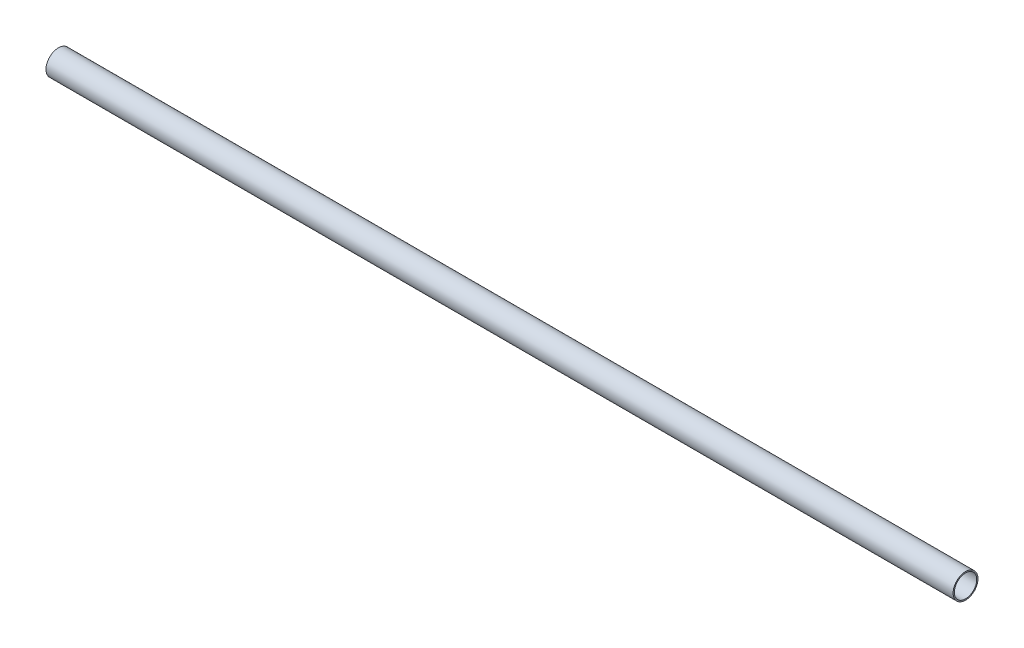
ISO-10303-21;
HEADER;
FILE_DESCRIPTION(('STEP AP214'),'2;1');
FILE_NAME('part.step','',(''),(''),'','','');
FILE_SCHEMA(('AUTOMOTIVE_DESIGN { 1 0 10303 214 1 1 1 1 }'));
ENDSEC;
DATA;
#1=APPLICATION_CONTEXT('core data for automotive mechanical design processes');
#2=APPLICATION_PROTOCOL_DEFINITION('international standard','automotive_design',2000,#1);
#3=PRODUCT_CONTEXT('',#1,'mechanical');
#4=PRODUCT('Part','Part','',(#3));
#5=PRODUCT_RELATED_PRODUCT_CATEGORY('part','',(#4));
#6=PRODUCT_DEFINITION_FORMATION('','',#4);
#7=PRODUCT_DEFINITION_CONTEXT('part definition',#1,'design');
#8=PRODUCT_DEFINITION('design','',#6,#7);
#9=PRODUCT_DEFINITION_SHAPE('','',#8);
#10=(LENGTH_UNIT() NAMED_UNIT(*) SI_UNIT(.MILLI.,.METRE.));
#11=(NAMED_UNIT(*) PLANE_ANGLE_UNIT() SI_UNIT($,.RADIAN.));
#12=(NAMED_UNIT(*) SI_UNIT($,.STERADIAN.) SOLID_ANGLE_UNIT());
#13=UNCERTAINTY_MEASURE_WITH_UNIT(LENGTH_MEASURE(1.E-05),#10,'distance_accuracy_value','');
#14=(GEOMETRIC_REPRESENTATION_CONTEXT(3) GLOBAL_UNCERTAINTY_ASSIGNED_CONTEXT((#13)) GLOBAL_UNIT_ASSIGNED_CONTEXT((#10,
#11,#12)) REPRESENTATION_CONTEXT('',''));
#15=CARTESIAN_POINT('',(0.,0.,0.));
#16=DIRECTION('',(0.,0.,1.));
#17=DIRECTION('',(1.,0.,0.));
#18=AXIS2_PLACEMENT_3D('',#15,#16,#17);
#19=CARTESIAN_POINT('',(729.,0.,0.));
#20=DIRECTION('',(1.,0.,0.));
#21=DIRECTION('',(0.,0.,-1.));
#22=AXIS2_PLACEMENT_3D('',#19,#20,#21);
#23=PLANE('',#22);
#24=CARTESIAN_POINT('',(729.,0.,0.));
#25=DIRECTION('',(1.,0.,0.));
#26=DIRECTION('',(0.,0.,-1.));
#27=AXIS2_PLACEMENT_3D('',#24,#25,#26);
#28=CIRCLE('',#27,10.);
#29=CARTESIAN_POINT('',(729.,0.,-10.));
#30=VERTEX_POINT('',#29);
#31=EDGE_CURVE('E10',#30,#30,#28,.T.);
#32=ORIENTED_EDGE('',*,*,#31,.T.);
#33=EDGE_LOOP('',(#32));
#34=FACE_BOUND('',#33,.T.);
#35=CARTESIAN_POINT('',(729.,0.,0.));
#36=DIRECTION('',(1.,0.,0.));
#37=DIRECTION('',(0.,0.,-1.));
#38=AXIS2_PLACEMENT_3D('',#35,#36,#37);
#39=CIRCLE('',#38,9.);
#40=CARTESIAN_POINT('',(729.,0.,-9.));
#41=VERTEX_POINT('',#40);
#42=EDGE_CURVE('E52',#41,#41,#39,.T.);
#43=ORIENTED_EDGE('',*,*,#42,.F.);
#44=EDGE_LOOP('',(#43));
#45=FACE_BOUND('',#44,.T.);
#46=ADVANCED_FACE('F39',(#34,#45),#23,.T.);
#47=CARTESIAN_POINT('',(0.,0.,0.));
#48=DIRECTION('',(1.,0.,0.));
#49=DIRECTION('',(0.,0.,-1.));
#50=AXIS2_PLACEMENT_3D('',#47,#48,#49);
#51=PLANE('',#50);
#52=CARTESIAN_POINT('',(0.,0.,0.));
#53=DIRECTION('',(1.,0.,0.));
#54=DIRECTION('',(0.,0.,-1.));
#55=AXIS2_PLACEMENT_3D('',#52,#53,#54);
#56=CIRCLE('',#55,10.);
#57=CARTESIAN_POINT('',(0.,0.,-10.));
#58=VERTEX_POINT('',#57);
#59=EDGE_CURVE('E43',#58,#58,#56,.T.);
#60=ORIENTED_EDGE('',*,*,#59,.F.);
#61=EDGE_LOOP('',(#60));
#62=FACE_BOUND('',#61,.T.);
#63=CARTESIAN_POINT('',(0.,0.,0.));
#64=DIRECTION('',(1.,0.,0.));
#65=DIRECTION('',(0.,0.,-1.));
#66=AXIS2_PLACEMENT_3D('',#63,#64,#65);
#67=CIRCLE('',#66,9.);
#68=CARTESIAN_POINT('',(0.,0.,-9.));
#69=VERTEX_POINT('',#68);
#70=EDGE_CURVE('E54',#69,#69,#67,.T.);
#71=ORIENTED_EDGE('',*,*,#70,.T.);
#72=EDGE_LOOP('',(#71));
#73=FACE_BOUND('',#72,.T.);
#74=ADVANCED_FACE('F66',(#62,#73),#51,.F.);
#75=CARTESIAN_POINT('',(729.,0.,0.));
#76=DIRECTION('',(-1.,0.,0.));
#77=DIRECTION('',(0.,0.,1.));
#78=AXIS2_PLACEMENT_3D('',#75,#76,#77);
#79=CYLINDRICAL_SURFACE('',#78,10.);
#80=ORIENTED_EDGE('',*,*,#31,.F.);
#81=EDGE_LOOP('',(#80));
#82=FACE_BOUND('',#81,.T.);
#83=ORIENTED_EDGE('',*,*,#59,.T.);
#84=EDGE_LOOP('',(#83));
#85=FACE_BOUND('',#84,.T.);
#86=ADVANCED_FACE('F41',(#82,#85),#79,.T.);
#87=CARTESIAN_POINT('',(729.,0.,0.));
#88=DIRECTION('',(-1.,0.,0.));
#89=DIRECTION('',(0.,0.,1.));
#90=AXIS2_PLACEMENT_3D('',#87,#88,#89);
#91=CYLINDRICAL_SURFACE('',#90,9.);
#92=ORIENTED_EDGE('',*,*,#42,.T.);
#93=EDGE_LOOP('',(#92));
#94=FACE_BOUND('',#93,.T.);
#95=ORIENTED_EDGE('',*,*,#70,.F.);
#96=EDGE_LOOP('',(#95));
#97=FACE_BOUND('',#96,.T.);
#98=ADVANCED_FACE('F62',(#94,#97),#91,.F.);
#99=CLOSED_SHELL('',(#46,#74,#86,#98));
#100=MANIFOLD_SOLID_BREP('B2',#99);
#101=ADVANCED_BREP_SHAPE_REPRESENTATION('',(#18,#100),#14);
#102=SHAPE_DEFINITION_REPRESENTATION(#9,#101);
ENDSEC;
END-ISO-10303-21;
